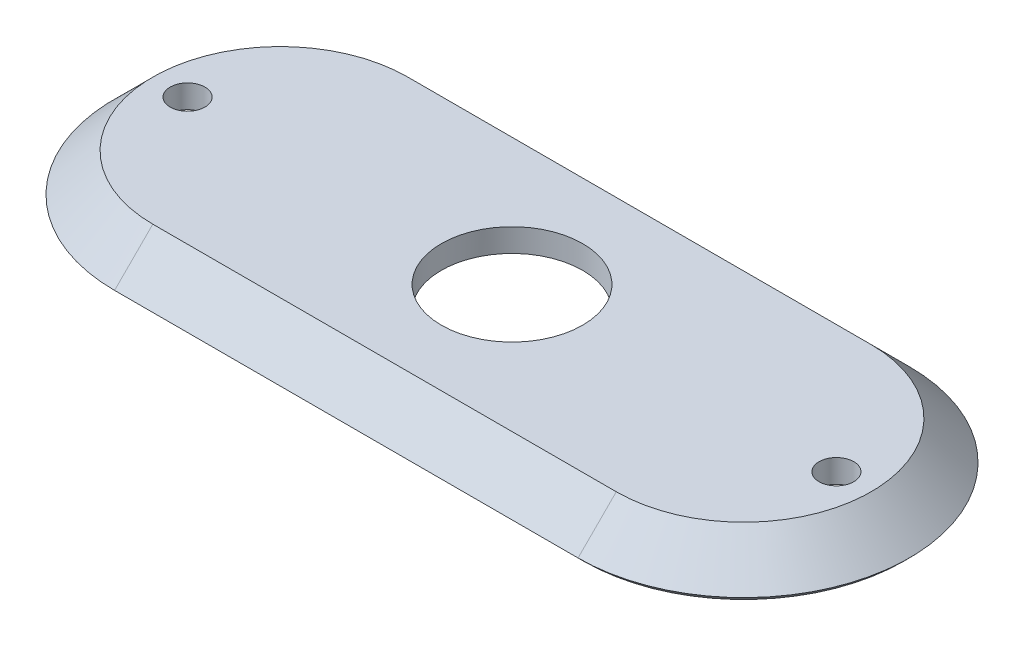
ISO-10303-21;
HEADER;
FILE_DESCRIPTION(('STEP AP214'),'2;1');
FILE_NAME('part.step','',(''),(''),'','','');
FILE_SCHEMA(('AUTOMOTIVE_DESIGN { 1 0 10303 214 1 1 1 1 }'));
ENDSEC;
DATA;
#1=APPLICATION_CONTEXT('core data for automotive mechanical design processes');
#2=APPLICATION_PROTOCOL_DEFINITION('international standard','automotive_design',2000,#1);
#3=PRODUCT_CONTEXT('',#1,'mechanical');
#4=PRODUCT('Part','Part','',(#3));
#5=PRODUCT_RELATED_PRODUCT_CATEGORY('part','',(#4));
#6=PRODUCT_DEFINITION_FORMATION('','',#4);
#7=PRODUCT_DEFINITION_CONTEXT('part definition',#1,'design');
#8=PRODUCT_DEFINITION('design','',#6,#7);
#9=PRODUCT_DEFINITION_SHAPE('','',#8);
#10=(LENGTH_UNIT() NAMED_UNIT(*) SI_UNIT(.MILLI.,.METRE.));
#11=(NAMED_UNIT(*) PLANE_ANGLE_UNIT() SI_UNIT($,.RADIAN.));
#12=(NAMED_UNIT(*) SI_UNIT($,.STERADIAN.) SOLID_ANGLE_UNIT());
#13=UNCERTAINTY_MEASURE_WITH_UNIT(LENGTH_MEASURE(1.E-05),#10,'distance_accuracy_value','');
#14=(GEOMETRIC_REPRESENTATION_CONTEXT(3) GLOBAL_UNCERTAINTY_ASSIGNED_CONTEXT((#13)) GLOBAL_UNIT_ASSIGNED_CONTEXT((#10,
#11,#12)) REPRESENTATION_CONTEXT('',''));
#15=CARTESIAN_POINT('',(0.,0.,0.));
#16=DIRECTION('',(0.,0.,1.));
#17=DIRECTION('',(1.,0.,0.));
#18=AXIS2_PLACEMENT_3D('',#15,#16,#17);
#19=CARTESIAN_POINT('',(-20.,0.,0.));
#20=DIRECTION('',(0.,-1.,0.));
#21=DIRECTION('',(0.,0.,1.));
#22=AXIS2_PLACEMENT_3D('',#19,#20,#21);
#23=CONICAL_SURFACE('',#22,14.8,0.78539816339745);
#24=DIRECTION('',(0.,-0.707106781186546,-0.707106781186549));
#25=VECTOR('',#24,1.);
#26=CARTESIAN_POINT('',(-20.,0.,-14.8));
#27=LINE('',#26,#25);
#28=CARTESIAN_POINT('',(-20.,3.8,-11.));
#29=VERTEX_POINT('',#28);
#30=CARTESIAN_POINT('',(-20.,0.500000000000007,-14.3));
#31=VERTEX_POINT('',#30);
#32=EDGE_CURVE('E166',#29,#31,#27,.T.);
#33=ORIENTED_EDGE('',*,*,#32,.T.);
#34=CARTESIAN_POINT('',(-20.,0.500000000000007,0.));
#35=DIRECTION('',(0.,1.,0.));
#36=DIRECTION('',(0.,0.,1.));
#37=AXIS2_PLACEMENT_3D('',#34,#35,#36);
#38=CIRCLE('',#37,14.3);
#39=CARTESIAN_POINT('',(-20.,0.500000000000011,14.3));
#40=VERTEX_POINT('',#39);
#41=EDGE_CURVE('E164',#31,#40,#38,.T.);
#42=ORIENTED_EDGE('',*,*,#41,.T.);
#43=DIRECTION('',(0.,-0.707106781186546,0.707106781186549));
#44=VECTOR('',#43,1.);
#45=CARTESIAN_POINT('',(-20.,0.,14.8));
#46=LINE('',#45,#44);
#47=CARTESIAN_POINT('',(-20.,3.8,11.));
#48=VERTEX_POINT('',#47);
#49=EDGE_CURVE('E162',#48,#40,#46,.T.);
#50=ORIENTED_EDGE('',*,*,#49,.F.);
#51=CARTESIAN_POINT('',(-20.,3.8,0.));
#52=DIRECTION('',(0.,1.,0.));
#53=DIRECTION('',(0.,0.,1.));
#54=AXIS2_PLACEMENT_3D('',#51,#52,#53);
#55=CIRCLE('',#54,11.);
#56=EDGE_CURVE('E137',#29,#48,#55,.T.);
#57=ORIENTED_EDGE('',*,*,#56,.F.);
#58=EDGE_LOOP('',(#33,#42,#50,#57));
#59=FACE_BOUND('',#58,.T.);
#60=ADVANCED_FACE('F33',(#59),#23,.T.);
#61=CARTESIAN_POINT('',(-20.,0.,14.8));
#62=DIRECTION('',(0.,0.707106781186549,0.707106781186546));
#63=DIRECTION('',(0.,-0.707106781186546,0.707106781186549));
#64=AXIS2_PLACEMENT_3D('',#61,#62,#63);
#65=PLANE('',#64);
#66=ORIENTED_EDGE('',*,*,#49,.T.);
#67=DIRECTION('',(-1.,0.,0.));
#68=VECTOR('',#67,1.);
#69=CARTESIAN_POINT('',(-20.,0.500000000000009,14.3));
#70=LINE('',#69,#68);
#71=CARTESIAN_POINT('',(20.,0.500000000000007,14.3));
#72=VERTEX_POINT('',#71);
#73=EDGE_CURVE('E56',#40,#72,#70,.F.);
#74=ORIENTED_EDGE('',*,*,#73,.T.);
#75=DIRECTION('',(0.,-0.707106781186546,0.707106781186549));
#76=VECTOR('',#75,1.);
#77=CARTESIAN_POINT('',(20.,0.,14.8));
#78=LINE('',#77,#76);
#79=CARTESIAN_POINT('',(20.,3.8,11.));
#80=VERTEX_POINT('',#79);
#81=EDGE_CURVE('E165',#80,#72,#78,.T.);
#82=ORIENTED_EDGE('',*,*,#81,.F.);
#83=DIRECTION('',(-1.,0.,0.));
#84=VECTOR('',#83,1.);
#85=CARTESIAN_POINT('',(-20.,3.8,11.));
#86=LINE('',#85,#84);
#87=EDGE_CURVE('E141',#48,#80,#86,.F.);
#88=ORIENTED_EDGE('',*,*,#87,.F.);
#89=EDGE_LOOP('',(#66,#74,#82,#88));
#90=FACE_BOUND('',#89,.T.);
#91=ADVANCED_FACE('F220',(#90),#65,.T.);
#92=CARTESIAN_POINT('',(20.,0.,0.));
#93=DIRECTION('',(0.,-1.,0.));
#94=DIRECTION('',(0.,0.,1.));
#95=AXIS2_PLACEMENT_3D('',#92,#93,#94);
#96=CONICAL_SURFACE('',#95,14.8,0.78539816339745);
#97=ORIENTED_EDGE('',*,*,#81,.T.);
#98=CARTESIAN_POINT('',(20.,0.500000000000007,0.));
#99=DIRECTION('',(0.,1.,0.));
#100=DIRECTION('',(0.,0.,1.));
#101=AXIS2_PLACEMENT_3D('',#98,#99,#100);
#102=CIRCLE('',#101,14.3);
#103=CARTESIAN_POINT('',(20.,0.500000000000007,-14.3));
#104=VERTEX_POINT('',#103);
#105=EDGE_CURVE('E11',#72,#104,#102,.T.);
#106=ORIENTED_EDGE('',*,*,#105,.T.);
#107=DIRECTION('',(0.,-0.707106781186546,-0.707106781186549));
#108=VECTOR('',#107,1.);
#109=CARTESIAN_POINT('',(20.,0.,-14.8));
#110=LINE('',#109,#108);
#111=CARTESIAN_POINT('',(20.,3.8,-11.));
#112=VERTEX_POINT('',#111);
#113=EDGE_CURVE('E169',#112,#104,#110,.T.);
#114=ORIENTED_EDGE('',*,*,#113,.F.);
#115=CARTESIAN_POINT('',(20.,3.8,0.));
#116=DIRECTION('',(0.,1.,0.));
#117=DIRECTION('',(0.,0.,1.));
#118=AXIS2_PLACEMENT_3D('',#115,#116,#117);
#119=CIRCLE('',#118,11.);
#120=EDGE_CURVE('E174',#80,#112,#119,.T.);
#121=ORIENTED_EDGE('',*,*,#120,.F.);
#122=EDGE_LOOP('',(#97,#106,#114,#121));
#123=FACE_BOUND('',#122,.T.);
#124=ADVANCED_FACE('F227',(#123),#96,.T.);
#125=CARTESIAN_POINT('',(-20.,0.,-14.8));
#126=DIRECTION('',(0.,0.707106781186549,-0.707106781186546));
#127=DIRECTION('',(0.,0.707106781186546,0.707106781186549));
#128=AXIS2_PLACEMENT_3D('',#125,#126,#127);
#129=PLANE('',#128);
#130=ORIENTED_EDGE('',*,*,#113,.T.);
#131=DIRECTION('',(1.,0.,0.));
#132=VECTOR('',#131,1.);
#133=CARTESIAN_POINT('',(-20.,0.500000000000009,-14.3));
#134=LINE('',#133,#132);
#135=EDGE_CURVE('E42',#104,#31,#134,.F.);
#136=ORIENTED_EDGE('',*,*,#135,.T.);
#137=ORIENTED_EDGE('',*,*,#32,.F.);
#138=DIRECTION('',(1.,0.,0.));
#139=VECTOR('',#138,1.);
#140=CARTESIAN_POINT('',(-20.,3.8,-11.));
#141=LINE('',#140,#139);
#142=EDGE_CURVE('E170',#112,#29,#141,.F.);
#143=ORIENTED_EDGE('',*,*,#142,.F.);
#144=EDGE_LOOP('',(#130,#136,#137,#143));
#145=FACE_BOUND('',#144,.T.);
#146=ADVANCED_FACE('F226',(#145),#129,.T.);
#147=CARTESIAN_POINT('',(-20.,3.8,0.));
#148=DIRECTION('',(0.,1.,0.));
#149=DIRECTION('',(0.,0.,1.));
#150=AXIS2_PLACEMENT_3D('',#147,#148,#149);
#151=PLANE('',#150);
#152=CARTESIAN_POINT('',(0.,3.8,0.));
#153=DIRECTION('',(0.,1.,0.));
#154=DIRECTION('',(0.,0.,1.));
#155=AXIS2_PLACEMENT_3D('',#152,#153,#154);
#156=CIRCLE('',#155,6.1);
#157=CARTESIAN_POINT('',(0.,3.8,6.1));
#158=VERTEX_POINT('',#157);
#159=EDGE_CURVE('E277',#158,#158,#156,.F.);
#160=ORIENTED_EDGE('',*,*,#159,.T.);
#161=EDGE_LOOP('',(#160));
#162=FACE_BOUND('',#161,.T.);
#163=CARTESIAN_POINT('',(28.,3.8,0.));
#164=DIRECTION('',(0.,1.,0.));
#165=DIRECTION('',(0.,0.,-1.));
#166=AXIS2_PLACEMENT_3D('',#163,#164,#165);
#167=CIRCLE('',#166,1.5);
#168=CARTESIAN_POINT('',(28.,3.8,1.49999999999998));
#169=VERTEX_POINT('',#168);
#170=EDGE_CURVE('E281',#169,#169,#167,.T.);
#171=ORIENTED_EDGE('',*,*,#170,.F.);
#172=EDGE_LOOP('',(#171));
#173=FACE_BOUND('',#172,.T.);
#174=CARTESIAN_POINT('',(-28.,3.8,0.));
#175=DIRECTION('',(0.,1.,0.));
#176=DIRECTION('',(0.,0.,1.));
#177=AXIS2_PLACEMENT_3D('',#174,#175,#176);
#178=CIRCLE('',#177,1.5);
#179=CARTESIAN_POINT('',(-28.,3.8,1.5));
#180=VERTEX_POINT('',#179);
#181=EDGE_CURVE('E289',#180,#180,#178,.T.);
#182=ORIENTED_EDGE('',*,*,#181,.F.);
#183=EDGE_LOOP('',(#182));
#184=FACE_BOUND('',#183,.T.);
#185=ORIENTED_EDGE('',*,*,#56,.T.);
#186=ORIENTED_EDGE('',*,*,#87,.T.);
#187=ORIENTED_EDGE('',*,*,#120,.T.);
#188=ORIENTED_EDGE('',*,*,#142,.T.);
#189=EDGE_LOOP('',(#185,#186,#187,#188));
#190=FACE_BOUND('',#189,.T.);
#191=ADVANCED_FACE('F223',(#162,#173,#184,#190),#151,.T.);
#192=CARTESIAN_POINT('',(-20.,0.,0.));
#193=DIRECTION('',(0.,1.,0.));
#194=DIRECTION('',(0.,0.,1.));
#195=AXIS2_PLACEMENT_3D('',#192,#193,#194);
#196=PLANE('',#195);
#197=DIRECTION('',(-1.,0.,0.));
#198=VECTOR('',#197,1.);
#199=CARTESIAN_POINT('',(-20.,0.,13.8));
#200=LINE('',#199,#198);
#201=CARTESIAN_POINT('',(20.,0.,13.8));
#202=VERTEX_POINT('',#201);
#203=CARTESIAN_POINT('',(-20.,0.,13.8));
#204=VERTEX_POINT('',#203);
#205=EDGE_CURVE('E183',#202,#204,#200,.T.);
#206=ORIENTED_EDGE('',*,*,#205,.T.);
#207=CARTESIAN_POINT('',(-20.,0.,0.));
#208=DIRECTION('',(0.,1.,0.));
#209=DIRECTION('',(0.,0.,1.));
#210=AXIS2_PLACEMENT_3D('',#207,#208,#209);
#211=CIRCLE('',#210,13.8);
#212=CARTESIAN_POINT('',(-20.,0.,-13.8));
#213=VERTEX_POINT('',#212);
#214=EDGE_CURVE('E185',#204,#213,#211,.F.);
#215=ORIENTED_EDGE('',*,*,#214,.T.);
#216=DIRECTION('',(1.,0.,0.));
#217=VECTOR('',#216,1.);
#218=CARTESIAN_POINT('',(-20.,0.,-13.8));
#219=LINE('',#218,#217);
#220=CARTESIAN_POINT('',(20.,0.,-13.8));
#221=VERTEX_POINT('',#220);
#222=EDGE_CURVE('E181',#213,#221,#219,.T.);
#223=ORIENTED_EDGE('',*,*,#222,.T.);
#224=CARTESIAN_POINT('',(20.,0.,0.));
#225=DIRECTION('',(0.,1.,0.));
#226=DIRECTION('',(0.,0.,1.));
#227=AXIS2_PLACEMENT_3D('',#224,#225,#226);
#228=CIRCLE('',#227,13.8);
#229=EDGE_CURVE('E179',#221,#202,#228,.F.);
#230=ORIENTED_EDGE('',*,*,#229,.T.);
#231=EDGE_LOOP('',(#206,#215,#223,#230));
#232=FACE_BOUND('',#231,.T.);
#233=DIRECTION('',(1.,0.,0.));
#234=VECTOR('',#233,1.);
#235=CARTESIAN_POINT('',(-20.,0.,-11.9715728752538));
#236=LINE('',#235,#234);
#237=CARTESIAN_POINT('',(20.,0.,-11.9715728752538));
#238=VERTEX_POINT('',#237);
#239=CARTESIAN_POINT('',(-20.,0.,-11.9715728752538));
#240=VERTEX_POINT('',#239);
#241=EDGE_CURVE('E132',#238,#240,#236,.F.);
#242=ORIENTED_EDGE('',*,*,#241,.T.);
#243=CARTESIAN_POINT('',(-20.,0.,0.));
#244=DIRECTION('',(0.,1.,0.));
#245=DIRECTION('',(0.,0.,1.));
#246=AXIS2_PLACEMENT_3D('',#243,#244,#245);
#247=CIRCLE('',#246,11.9715728752538);
#248=CARTESIAN_POINT('',(-20.,0.,11.9715728752538));
#249=VERTEX_POINT('',#248);
#250=EDGE_CURVE('E154',#240,#249,#247,.T.);
#251=ORIENTED_EDGE('',*,*,#250,.T.);
#252=DIRECTION('',(-1.,0.,0.));
#253=VECTOR('',#252,1.);
#254=CARTESIAN_POINT('',(-20.,0.,11.9715728752538));
#255=LINE('',#254,#253);
#256=CARTESIAN_POINT('',(20.,0.,11.9715728752538));
#257=VERTEX_POINT('',#256);
#258=EDGE_CURVE('E136',#249,#257,#255,.F.);
#259=ORIENTED_EDGE('',*,*,#258,.T.);
#260=CARTESIAN_POINT('',(20.,0.,0.));
#261=DIRECTION('',(0.,1.,0.));
#262=DIRECTION('',(0.,0.,1.));
#263=AXIS2_PLACEMENT_3D('',#260,#261,#262);
#264=CIRCLE('',#263,11.9715728752538);
#265=EDGE_CURVE('E158',#257,#238,#264,.T.);
#266=ORIENTED_EDGE('',*,*,#265,.T.);
#267=EDGE_LOOP('',(#242,#251,#259,#266));
#268=FACE_BOUND('',#267,.T.);
#269=ADVANCED_FACE('F208',(#232,#268),#196,.F.);
#270=CARTESIAN_POINT('',(-20.,-1.4142135623731,0.));
#271=DIRECTION('',(0.,-1.,0.));
#272=DIRECTION('',(0.,0.,1.));
#273=AXIS2_PLACEMENT_3D('',#270,#271,#272);
#274=CONICAL_SURFACE('',#273,13.3857864376269,0.78539816339745);
#275=ORIENTED_EDGE('',*,*,#250,.F.);
#276=DIRECTION('',(0.,-0.707106781186546,-0.707106781186549));
#277=VECTOR('',#276,1.);
#278=CARTESIAN_POINT('',(-20.,-1.4142135623731,-13.3857864376269));
#279=LINE('',#278,#277);
#280=CARTESIAN_POINT('',(-20.,1.8,-10.1715728752538));
#281=VERTEX_POINT('',#280);
#282=EDGE_CURVE('E131',#281,#240,#279,.T.);
#283=ORIENTED_EDGE('',*,*,#282,.F.);
#284=CARTESIAN_POINT('',(-20.,1.8,0.));
#285=DIRECTION('',(0.,1.,0.));
#286=DIRECTION('',(0.,0.,1.));
#287=AXIS2_PLACEMENT_3D('',#284,#285,#286);
#288=CIRCLE('',#287,10.1715728752538);
#289=CARTESIAN_POINT('',(-20.,1.8,10.1715728752538));
#290=VERTEX_POINT('',#289);
#291=EDGE_CURVE('E117',#281,#290,#288,.T.);
#292=ORIENTED_EDGE('',*,*,#291,.T.);
#293=DIRECTION('',(0.,-0.707106781186546,0.707106781186549));
#294=VECTOR('',#293,1.);
#295=CARTESIAN_POINT('',(-20.,-1.4142135623731,13.3857864376269));
#296=LINE('',#295,#294);
#297=EDGE_CURVE('E129',#290,#249,#296,.T.);
#298=ORIENTED_EDGE('',*,*,#297,.T.);
#299=EDGE_LOOP('',(#275,#283,#292,#298));
#300=FACE_BOUND('',#299,.T.);
#301=ADVANCED_FACE('F128',(#300),#274,.F.);
#302=CARTESIAN_POINT('',(-20.,-1.4142135623731,13.3857864376269));
#303=DIRECTION('',(0.,0.707106781186549,0.707106781186546));
#304=DIRECTION('',(0.,-0.707106781186546,0.707106781186549));
#305=AXIS2_PLACEMENT_3D('',#302,#303,#304);
#306=PLANE('',#305);
#307=ORIENTED_EDGE('',*,*,#258,.F.);
#308=ORIENTED_EDGE('',*,*,#297,.F.);
#309=DIRECTION('',(-1.,0.,0.));
#310=VECTOR('',#309,1.);
#311=CARTESIAN_POINT('',(-20.,1.8,10.1715728752538));
#312=LINE('',#311,#310);
#313=CARTESIAN_POINT('',(20.,1.8,10.1715728752538));
#314=VERTEX_POINT('',#313);
#315=EDGE_CURVE('E113',#290,#314,#312,.F.);
#316=ORIENTED_EDGE('',*,*,#315,.T.);
#317=DIRECTION('',(0.,-0.707106781186546,0.707106781186549));
#318=VECTOR('',#317,1.);
#319=CARTESIAN_POINT('',(20.,-1.4142135623731,13.3857864376269));
#320=LINE('',#319,#318);
#321=EDGE_CURVE('E138',#314,#257,#320,.T.);
#322=ORIENTED_EDGE('',*,*,#321,.T.);
#323=EDGE_LOOP('',(#307,#308,#316,#322));
#324=FACE_BOUND('',#323,.T.);
#325=ADVANCED_FACE('F134',(#324),#306,.F.);
#326=CARTESIAN_POINT('',(20.,-1.4142135623731,0.));
#327=DIRECTION('',(0.,-1.,0.));
#328=DIRECTION('',(0.,0.,1.));
#329=AXIS2_PLACEMENT_3D('',#326,#327,#328);
#330=CONICAL_SURFACE('',#329,13.3857864376269,0.78539816339745);
#331=ORIENTED_EDGE('',*,*,#265,.F.);
#332=ORIENTED_EDGE('',*,*,#321,.F.);
#333=CARTESIAN_POINT('',(20.,1.8,0.));
#334=DIRECTION('',(0.,1.,0.));
#335=DIRECTION('',(0.,0.,1.));
#336=AXIS2_PLACEMENT_3D('',#333,#334,#335);
#337=CIRCLE('',#336,10.1715728752538);
#338=CARTESIAN_POINT('',(20.,1.8,-10.1715728752538));
#339=VERTEX_POINT('',#338);
#340=EDGE_CURVE('E118',#314,#339,#337,.T.);
#341=ORIENTED_EDGE('',*,*,#340,.T.);
#342=DIRECTION('',(0.,0.707106781186546,0.707106781186549));
#343=VECTOR('',#342,1.);
#344=CARTESIAN_POINT('',(20.,-1.41421356237309,-13.3857864376269));
#345=LINE('',#344,#343);
#346=EDGE_CURVE('E143',#339,#238,#345,.F.);
#347=ORIENTED_EDGE('',*,*,#346,.T.);
#348=EDGE_LOOP('',(#331,#332,#341,#347));
#349=FACE_BOUND('',#348,.T.);
#350=ADVANCED_FACE('F252',(#349),#330,.F.);
#351=CARTESIAN_POINT('',(-20.,-1.4142135623731,-13.3857864376269));
#352=DIRECTION('',(0.,0.707106781186549,-0.707106781186546));
#353=DIRECTION('',(0.,0.707106781186546,0.707106781186549));
#354=AXIS2_PLACEMENT_3D('',#351,#352,#353);
#355=PLANE('',#354);
#356=ORIENTED_EDGE('',*,*,#241,.F.);
#357=ORIENTED_EDGE('',*,*,#346,.F.);
#358=DIRECTION('',(1.,0.,0.));
#359=VECTOR('',#358,1.);
#360=CARTESIAN_POINT('',(-20.,1.8,-10.1715728752538));
#361=LINE('',#360,#359);
#362=EDGE_CURVE('E149',#339,#281,#361,.F.);
#363=ORIENTED_EDGE('',*,*,#362,.T.);
#364=ORIENTED_EDGE('',*,*,#282,.T.);
#365=EDGE_LOOP('',(#356,#357,#363,#364));
#366=FACE_BOUND('',#365,.T.);
#367=ADVANCED_FACE('F248',(#366),#355,.F.);
#368=CARTESIAN_POINT('',(-20.,1.8,0.));
#369=DIRECTION('',(0.,1.,0.));
#370=DIRECTION('',(0.,0.,1.));
#371=AXIS2_PLACEMENT_3D('',#368,#369,#370);
#372=PLANE('',#371);
#373=CARTESIAN_POINT('',(0.,1.8,0.));
#374=DIRECTION('',(0.,-1.,0.));
#375=DIRECTION('',(0.,0.,-1.));
#376=AXIS2_PLACEMENT_3D('',#373,#374,#375);
#377=CIRCLE('',#376,6.1);
#378=CARTESIAN_POINT('',(0.,1.8,-6.1));
#379=VERTEX_POINT('',#378);
#380=EDGE_CURVE('E280',#379,#379,#377,.T.);
#381=ORIENTED_EDGE('',*,*,#380,.F.);
#382=EDGE_LOOP('',(#381));
#383=FACE_BOUND('',#382,.T.);
#384=CARTESIAN_POINT('',(28.,1.8,0.));
#385=DIRECTION('',(0.,1.,0.));
#386=DIRECTION('',(0.,0.,1.));
#387=AXIS2_PLACEMENT_3D('',#384,#385,#386);
#388=CIRCLE('',#387,1.5);
#389=CARTESIAN_POINT('',(28.,1.8,1.49999999999998));
#390=VERTEX_POINT('',#389);
#391=EDGE_CURVE('E284',#390,#390,#388,.F.);
#392=ORIENTED_EDGE('',*,*,#391,.F.);
#393=EDGE_LOOP('',(#392));
#394=FACE_BOUND('',#393,.T.);
#395=CARTESIAN_POINT('',(-28.,1.8,0.));
#396=DIRECTION('',(0.,1.,0.));
#397=DIRECTION('',(0.,0.,1.));
#398=AXIS2_PLACEMENT_3D('',#395,#396,#397);
#399=CIRCLE('',#398,1.5);
#400=CARTESIAN_POINT('',(-28.,1.8,1.5));
#401=VERTEX_POINT('',#400);
#402=EDGE_CURVE('E146',#401,#401,#399,.F.);
#403=ORIENTED_EDGE('',*,*,#402,.F.);
#404=EDGE_LOOP('',(#403));
#405=FACE_BOUND('',#404,.T.);
#406=ORIENTED_EDGE('',*,*,#291,.F.);
#407=ORIENTED_EDGE('',*,*,#362,.F.);
#408=ORIENTED_EDGE('',*,*,#340,.F.);
#409=ORIENTED_EDGE('',*,*,#315,.F.);
#410=EDGE_LOOP('',(#406,#407,#408,#409));
#411=FACE_BOUND('',#410,.T.);
#412=ADVANCED_FACE('F115',(#383,#394,#405,#411),#372,.F.);
#413=CARTESIAN_POINT('',(20.,0.500000000000009,0.));
#414=DIRECTION('',(0.,1.,0.));
#415=DIRECTION('',(0.,0.,1.));
#416=AXIS2_PLACEMENT_3D('',#413,#414,#415);
#417=CONICAL_SURFACE('',#416,14.3,0.785398163397441);
#418=DIRECTION('',(0.,0.707106781186553,0.707106781186543));
#419=VECTOR('',#418,1.);
#420=CARTESIAN_POINT('',(20.,0.,13.8));
#421=LINE('',#420,#419);
#422=EDGE_CURVE('E193',#202,#72,#421,.T.);
#423=ORIENTED_EDGE('',*,*,#422,.F.);
#424=ORIENTED_EDGE('',*,*,#229,.F.);
#425=DIRECTION('',(0.,-0.707106781186552,0.707106781186543));
#426=VECTOR('',#425,1.);
#427=CARTESIAN_POINT('',(20.,0.500000000000009,-14.3));
#428=LINE('',#427,#426);
#429=EDGE_CURVE('E37',#104,#221,#428,.T.);
#430=ORIENTED_EDGE('',*,*,#429,.F.);
#431=ORIENTED_EDGE('',*,*,#105,.F.);
#432=EDGE_LOOP('',(#423,#424,#430,#431));
#433=FACE_BOUND('',#432,.T.);
#434=ADVANCED_FACE('F35',(#433),#417,.T.);
#435=CARTESIAN_POINT('',(-20.,0.500000000000009,-14.3));
#436=DIRECTION('',(0.,-0.707106781186542,-0.707106781186553));
#437=DIRECTION('',(1.,0.,0.));
#438=AXIS2_PLACEMENT_3D('',#435,#436,#437);
#439=PLANE('',#438);
#440=ORIENTED_EDGE('',*,*,#429,.T.);
#441=ORIENTED_EDGE('',*,*,#222,.F.);
#442=DIRECTION('',(0.,-0.707106781186552,0.707106781186543));
#443=VECTOR('',#442,1.);
#444=CARTESIAN_POINT('',(-20.,0.500000000000009,-14.3));
#445=LINE('',#444,#443);
#446=EDGE_CURVE('E192',#31,#213,#445,.T.);
#447=ORIENTED_EDGE('',*,*,#446,.F.);
#448=ORIENTED_EDGE('',*,*,#135,.F.);
#449=EDGE_LOOP('',(#440,#441,#447,#448));
#450=FACE_BOUND('',#449,.T.);
#451=ADVANCED_FACE('F203',(#450),#439,.T.);
#452=CARTESIAN_POINT('',(-20.,0.500000000000009,14.3));
#453=DIRECTION('',(0.,-0.707106781186542,0.707106781186553));
#454=DIRECTION('',(-1.,0.,0.));
#455=AXIS2_PLACEMENT_3D('',#452,#453,#454);
#456=PLANE('',#455);
#457=ORIENTED_EDGE('',*,*,#422,.T.);
#458=ORIENTED_EDGE('',*,*,#73,.F.);
#459=DIRECTION('',(0.,0.707106781186552,0.707106781186543));
#460=VECTOR('',#459,1.);
#461=CARTESIAN_POINT('',(-20.,0.,13.8));
#462=LINE('',#461,#460);
#463=EDGE_CURVE('E190',#204,#40,#462,.T.);
#464=ORIENTED_EDGE('',*,*,#463,.F.);
#465=ORIENTED_EDGE('',*,*,#205,.F.);
#466=EDGE_LOOP('',(#457,#458,#464,#465));
#467=FACE_BOUND('',#466,.T.);
#468=ADVANCED_FACE('F215',(#467),#456,.T.);
#469=CARTESIAN_POINT('',(-20.,0.500000000000009,0.));
#470=DIRECTION('',(0.,1.,0.));
#471=DIRECTION('',(0.,0.,1.));
#472=AXIS2_PLACEMENT_3D('',#469,#470,#471);
#473=CONICAL_SURFACE('',#472,14.3,0.785398163397441);
#474=ORIENTED_EDGE('',*,*,#446,.T.);
#475=ORIENTED_EDGE('',*,*,#214,.F.);
#476=ORIENTED_EDGE('',*,*,#463,.T.);
#477=ORIENTED_EDGE('',*,*,#41,.F.);
#478=EDGE_LOOP('',(#474,#475,#476,#477));
#479=FACE_BOUND('',#478,.T.);
#480=ADVANCED_FACE('F213',(#479),#473,.T.);
#481=CARTESIAN_POINT('',(-28.,-0.00100000000000013,0.));
#482=DIRECTION('',(0.,1.,0.));
#483=DIRECTION('',(0.,0.,1.));
#484=AXIS2_PLACEMENT_3D('',#481,#482,#483);
#485=CYLINDRICAL_SURFACE('',#484,1.5);
#486=CARTESIAN_POINT('',(-28.,3.8,1.5));
#487=CARTESIAN_POINT('',(-28.,3.77916666666667,1.5));
#488=CARTESIAN_POINT('',(-28.,3.75833333333333,1.5));
#489=CARTESIAN_POINT('',(-28.,3.71666666666667,1.5));
#490=CARTESIAN_POINT('',(-28.,3.69583333333333,1.5));
#491=CARTESIAN_POINT('',(-28.,3.65416666666667,1.5));
#492=CARTESIAN_POINT('',(-28.,3.63333333333333,1.5));
#493=CARTESIAN_POINT('',(-28.,3.59166666666667,1.5));
#494=CARTESIAN_POINT('',(-28.,3.57083333333333,1.5));
#495=CARTESIAN_POINT('',(-28.,3.52916666666667,1.5));
#496=CARTESIAN_POINT('',(-28.,3.50833333333333,1.5));
#497=CARTESIAN_POINT('',(-28.,3.46666666666667,1.5));
#498=CARTESIAN_POINT('',(-28.,3.44583333333333,1.5));
#499=CARTESIAN_POINT('',(-28.,3.40416666666667,1.5));
#500=CARTESIAN_POINT('',(-28.,3.38333333333333,1.5));
#501=CARTESIAN_POINT('',(-28.,3.34166666666667,1.5));
#502=CARTESIAN_POINT('',(-28.,3.32083333333333,1.5));
#503=CARTESIAN_POINT('',(-28.,3.27916666666667,1.5));
#504=CARTESIAN_POINT('',(-28.,3.25833333333333,1.5));
#505=CARTESIAN_POINT('',(-28.,3.21666666666667,1.5));
#506=CARTESIAN_POINT('',(-28.,3.19583333333333,1.5));
#507=CARTESIAN_POINT('',(-28.,3.15416666666667,1.5));
#508=CARTESIAN_POINT('',(-28.,3.13333333333333,1.5));
#509=CARTESIAN_POINT('',(-28.,3.09166666666667,1.5));
#510=CARTESIAN_POINT('',(-28.,3.07083333333333,1.5));
#511=CARTESIAN_POINT('',(-28.,3.02916666666667,1.5));
#512=CARTESIAN_POINT('',(-28.,3.00833333333333,1.5));
#513=CARTESIAN_POINT('',(-28.,2.96666666666667,1.5));
#514=CARTESIAN_POINT('',(-28.,2.94583333333333,1.5));
#515=CARTESIAN_POINT('',(-28.,2.90416666666667,1.5));
#516=CARTESIAN_POINT('',(-28.,2.88333333333333,1.5));
#517=CARTESIAN_POINT('',(-28.,2.84166666666667,1.5));
#518=CARTESIAN_POINT('',(-28.,2.82083333333333,1.5));
#519=CARTESIAN_POINT('',(-28.,2.77916666666667,1.5));
#520=CARTESIAN_POINT('',(-28.,2.75833333333333,1.5));
#521=CARTESIAN_POINT('',(-28.,2.71666666666667,1.5));
#522=CARTESIAN_POINT('',(-28.,2.69583333333333,1.5));
#523=CARTESIAN_POINT('',(-28.,2.65416666666667,1.5));
#524=CARTESIAN_POINT('',(-28.,2.63333333333333,1.5));
#525=CARTESIAN_POINT('',(-28.,2.59166666666667,1.5));
#526=CARTESIAN_POINT('',(-28.,2.57083333333333,1.5));
#527=CARTESIAN_POINT('',(-28.,2.52916666666667,1.5));
#528=CARTESIAN_POINT('',(-28.,2.50833333333333,1.5));
#529=CARTESIAN_POINT('',(-28.,2.46666666666667,1.5));
#530=CARTESIAN_POINT('',(-28.,2.44583333333333,1.5));
#531=CARTESIAN_POINT('',(-28.,2.40416666666667,1.5));
#532=CARTESIAN_POINT('',(-28.,2.38333333333333,1.5));
#533=CARTESIAN_POINT('',(-28.,2.34166666666667,1.5));
#534=CARTESIAN_POINT('',(-28.,2.32083333333333,1.5));
#535=CARTESIAN_POINT('',(-28.,2.27916666666667,1.5));
#536=CARTESIAN_POINT('',(-28.,2.25833333333333,1.5));
#537=CARTESIAN_POINT('',(-28.,2.21666666666667,1.5));
#538=CARTESIAN_POINT('',(-28.,2.19583333333333,1.5));
#539=CARTESIAN_POINT('',(-28.,2.15416666666667,1.5));
#540=CARTESIAN_POINT('',(-28.,2.13333333333333,1.5));
#541=CARTESIAN_POINT('',(-28.,2.09166666666667,1.5));
#542=CARTESIAN_POINT('',(-28.,2.07083333333333,1.5));
#543=CARTESIAN_POINT('',(-28.,2.02916666666667,1.5));
#544=CARTESIAN_POINT('',(-28.,2.00833333333333,1.5));
#545=CARTESIAN_POINT('',(-28.,1.96666666666667,1.5));
#546=CARTESIAN_POINT('',(-28.,1.94583333333333,1.5));
#547=CARTESIAN_POINT('',(-28.,1.90416666666667,1.5));
#548=CARTESIAN_POINT('',(-28.,1.88333333333333,1.5));
#549=CARTESIAN_POINT('',(-28.,1.84166666666667,1.5));
#550=CARTESIAN_POINT('',(-28.,1.82083333333333,1.5));
#551=CARTESIAN_POINT('',(-28.,1.8,1.5));
#552=B_SPLINE_CURVE_WITH_KNOTS('',3,(#486,#487,#488,#489,#490,#491,#492,#493,#494,#495,#496,
#497,#498,#499,#500,#501,#502,#503,#504,#505,#506,#507,#508,#509,#510,#511,#512,#513,#514,#515,
#516,#517,#518,#519,#520,#521,#522,#523,#524,#525,#526,#527,#528,#529,#530,#531,#532,#533,#534,
#535,#536,#537,#538,#539,#540,#541,#542,#543,#544,#545,#546,#547,#548,#549,#550,#551),
.UNSPECIFIED.,.F.,.F.,(4,2,2,2,2,2,2,2,2,2,2,2,2,2,2,2,2,2,2,2,2,2,2,2,2,2,2,2,2,2,2,2,4),(0.,
0.0625000000000001,0.125,0.1875,0.25,0.3125,0.375,0.4375,0.5,0.5625,0.625,0.6875,0.75,0.8125,
0.875,0.9375,1.,1.0625,1.125,1.1875,1.25,1.3125,1.375,1.4375,1.5,1.5625,1.625,1.6875,1.75,
1.8125,1.875,1.9375,2.),.UNSPECIFIED.);
#553=EDGE_CURVE('BSEAM261',#180,#401,#552,.T.);
#554=ORIENTED_EDGE('',*,*,#181,.T.);
#555=ORIENTED_EDGE('',*,*,#402,.T.);
#556=ORIENTED_EDGE('',*,*,#553,.T.);
#557=ORIENTED_EDGE('',*,*,#553,.F.);
#558=EDGE_LOOP('',(#554,#556,#555,#557));
#559=FACE_BOUND('',#558,.T.);
#560=ADVANCED_FACE('F261',(#559),#485,.F.);
#561=CARTESIAN_POINT('',(28.,-0.00100000000000013,0.));
#562=DIRECTION('',(0.,1.,0.));
#563=DIRECTION('',(0.,0.,1.));
#564=AXIS2_PLACEMENT_3D('',#561,#562,#563);
#565=CYLINDRICAL_SURFACE('',#564,1.5);
#566=CARTESIAN_POINT('',(28.,3.8,1.49999999999998));
#567=CARTESIAN_POINT('',(28.,3.77916666666667,1.49999999999998));
#568=CARTESIAN_POINT('',(28.,3.75833333333333,1.49999999999998));
#569=CARTESIAN_POINT('',(28.,3.71666666666667,1.49999999999998));
#570=CARTESIAN_POINT('',(28.,3.69583333333333,1.49999999999998));
#571=CARTESIAN_POINT('',(28.,3.65416666666667,1.49999999999998));
#572=CARTESIAN_POINT('',(28.,3.63333333333333,1.49999999999998));
#573=CARTESIAN_POINT('',(28.,3.59166666666667,1.49999999999998));
#574=CARTESIAN_POINT('',(28.,3.57083333333333,1.49999999999998));
#575=CARTESIAN_POINT('',(28.,3.52916666666667,1.49999999999998));
#576=CARTESIAN_POINT('',(28.,3.50833333333333,1.49999999999998));
#577=CARTESIAN_POINT('',(28.,3.46666666666667,1.49999999999998));
#578=CARTESIAN_POINT('',(28.,3.44583333333333,1.49999999999998));
#579=CARTESIAN_POINT('',(28.,3.40416666666667,1.49999999999998));
#580=CARTESIAN_POINT('',(28.,3.38333333333333,1.49999999999998));
#581=CARTESIAN_POINT('',(28.,3.34166666666667,1.49999999999998));
#582=CARTESIAN_POINT('',(28.,3.32083333333333,1.49999999999998));
#583=CARTESIAN_POINT('',(28.,3.27916666666667,1.49999999999998));
#584=CARTESIAN_POINT('',(28.,3.25833333333333,1.49999999999998));
#585=CARTESIAN_POINT('',(28.,3.21666666666667,1.49999999999998));
#586=CARTESIAN_POINT('',(28.,3.19583333333333,1.49999999999998));
#587=CARTESIAN_POINT('',(28.,3.15416666666667,1.49999999999998));
#588=CARTESIAN_POINT('',(28.,3.13333333333333,1.49999999999998));
#589=CARTESIAN_POINT('',(28.,3.09166666666667,1.49999999999998));
#590=CARTESIAN_POINT('',(28.,3.07083333333333,1.49999999999998));
#591=CARTESIAN_POINT('',(28.,3.02916666666667,1.49999999999998));
#592=CARTESIAN_POINT('',(28.,3.00833333333333,1.49999999999998));
#593=CARTESIAN_POINT('',(28.,2.96666666666667,1.49999999999998));
#594=CARTESIAN_POINT('',(28.,2.94583333333333,1.49999999999998));
#595=CARTESIAN_POINT('',(28.,2.90416666666667,1.49999999999998));
#596=CARTESIAN_POINT('',(28.,2.88333333333333,1.49999999999998));
#597=CARTESIAN_POINT('',(28.,2.84166666666667,1.49999999999998));
#598=CARTESIAN_POINT('',(28.,2.82083333333333,1.49999999999998));
#599=CARTESIAN_POINT('',(28.,2.77916666666667,1.49999999999998));
#600=CARTESIAN_POINT('',(28.,2.75833333333333,1.49999999999998));
#601=CARTESIAN_POINT('',(28.,2.71666666666667,1.49999999999998));
#602=CARTESIAN_POINT('',(28.,2.69583333333333,1.49999999999998));
#603=CARTESIAN_POINT('',(28.,2.65416666666667,1.49999999999998));
#604=CARTESIAN_POINT('',(28.,2.63333333333333,1.49999999999998));
#605=CARTESIAN_POINT('',(28.,2.59166666666667,1.49999999999998));
#606=CARTESIAN_POINT('',(28.,2.57083333333333,1.49999999999998));
#607=CARTESIAN_POINT('',(28.,2.52916666666667,1.49999999999998));
#608=CARTESIAN_POINT('',(28.,2.50833333333333,1.49999999999998));
#609=CARTESIAN_POINT('',(28.,2.46666666666667,1.49999999999998));
#610=CARTESIAN_POINT('',(28.,2.44583333333333,1.49999999999998));
#611=CARTESIAN_POINT('',(28.,2.40416666666667,1.49999999999998));
#612=CARTESIAN_POINT('',(28.,2.38333333333333,1.49999999999998));
#613=CARTESIAN_POINT('',(28.,2.34166666666667,1.49999999999998));
#614=CARTESIAN_POINT('',(28.,2.32083333333333,1.49999999999998));
#615=CARTESIAN_POINT('',(28.,2.27916666666667,1.49999999999998));
#616=CARTESIAN_POINT('',(28.,2.25833333333333,1.49999999999998));
#617=CARTESIAN_POINT('',(28.,2.21666666666667,1.49999999999998));
#618=CARTESIAN_POINT('',(28.,2.19583333333333,1.49999999999998));
#619=CARTESIAN_POINT('',(28.,2.15416666666667,1.49999999999998));
#620=CARTESIAN_POINT('',(28.,2.13333333333333,1.49999999999998));
#621=CARTESIAN_POINT('',(28.,2.09166666666667,1.49999999999998));
#622=CARTESIAN_POINT('',(28.,2.07083333333333,1.49999999999998));
#623=CARTESIAN_POINT('',(28.,2.02916666666667,1.49999999999998));
#624=CARTESIAN_POINT('',(28.,2.00833333333333,1.49999999999998));
#625=CARTESIAN_POINT('',(28.,1.96666666666667,1.49999999999998));
#626=CARTESIAN_POINT('',(28.,1.94583333333333,1.49999999999998));
#627=CARTESIAN_POINT('',(28.,1.90416666666667,1.49999999999998));
#628=CARTESIAN_POINT('',(28.,1.88333333333333,1.49999999999998));
#629=CARTESIAN_POINT('',(28.,1.84166666666667,1.49999999999998));
#630=CARTESIAN_POINT('',(28.,1.82083333333333,1.49999999999998));
#631=CARTESIAN_POINT('',(28.,1.8,1.49999999999998));
#632=B_SPLINE_CURVE_WITH_KNOTS('',3,(#566,#567,#568,#569,#570,#571,#572,#573,#574,#575,#576,
#577,#578,#579,#580,#581,#582,#583,#584,#585,#586,#587,#588,#589,#590,#591,#592,#593,#594,#595,
#596,#597,#598,#599,#600,#601,#602,#603,#604,#605,#606,#607,#608,#609,#610,#611,#612,#613,#614,
#615,#616,#617,#618,#619,#620,#621,#622,#623,#624,#625,#626,#627,#628,#629,#630,#631),
.UNSPECIFIED.,.F.,.F.,(4,2,2,2,2,2,2,2,2,2,2,2,2,2,2,2,2,2,2,2,2,2,2,2,2,2,2,2,2,2,2,2,4),(0.,
0.0625000000000001,0.125,0.1875,0.25,0.3125,0.375,0.4375,0.5,0.5625,0.625,0.6875,0.75,0.8125,
0.875,0.9375,1.,1.0625,1.125,1.1875,1.25,1.3125,1.375,1.4375,1.5,1.5625,1.625,1.6875,1.75,
1.8125,1.875,1.9375,2.),.UNSPECIFIED.);
#633=EDGE_CURVE('BSEAM264',#169,#390,#632,.T.);
#634=ORIENTED_EDGE('',*,*,#170,.T.);
#635=ORIENTED_EDGE('',*,*,#391,.T.);
#636=ORIENTED_EDGE('',*,*,#633,.T.);
#637=ORIENTED_EDGE('',*,*,#633,.F.);
#638=EDGE_LOOP('',(#634,#636,#635,#637));
#639=FACE_BOUND('',#638,.T.);
#640=ADVANCED_FACE('F264',(#639),#565,.F.);
#641=CARTESIAN_POINT('',(0.,3.801,0.));
#642=DIRECTION('',(0.,-1.,0.));
#643=DIRECTION('',(0.,0.,-1.));
#644=AXIS2_PLACEMENT_3D('',#641,#642,#643);
#645=CYLINDRICAL_SURFACE('',#644,6.1);
#646=ORIENTED_EDGE('',*,*,#159,.F.);
#647=EDGE_LOOP('',(#646));
#648=FACE_BOUND('',#647,.T.);
#649=ORIENTED_EDGE('',*,*,#380,.T.);
#650=EDGE_LOOP('',(#649));
#651=FACE_BOUND('',#650,.T.);
#652=ADVANCED_FACE('F268',(#648,#651),#645,.F.);
#653=CLOSED_SHELL('',(#60,#91,#124,#146,#191,#269,#301,#325,#350,#367,#412,#434,#451,#468,#480,
#560,#640,#652));
#654=MANIFOLD_SOLID_BREP('B2',#653);
#655=ADVANCED_BREP_SHAPE_REPRESENTATION('',(#18,#654),#14);
#656=SHAPE_DEFINITION_REPRESENTATION(#9,#655);
ENDSEC;
END-ISO-10303-21;
